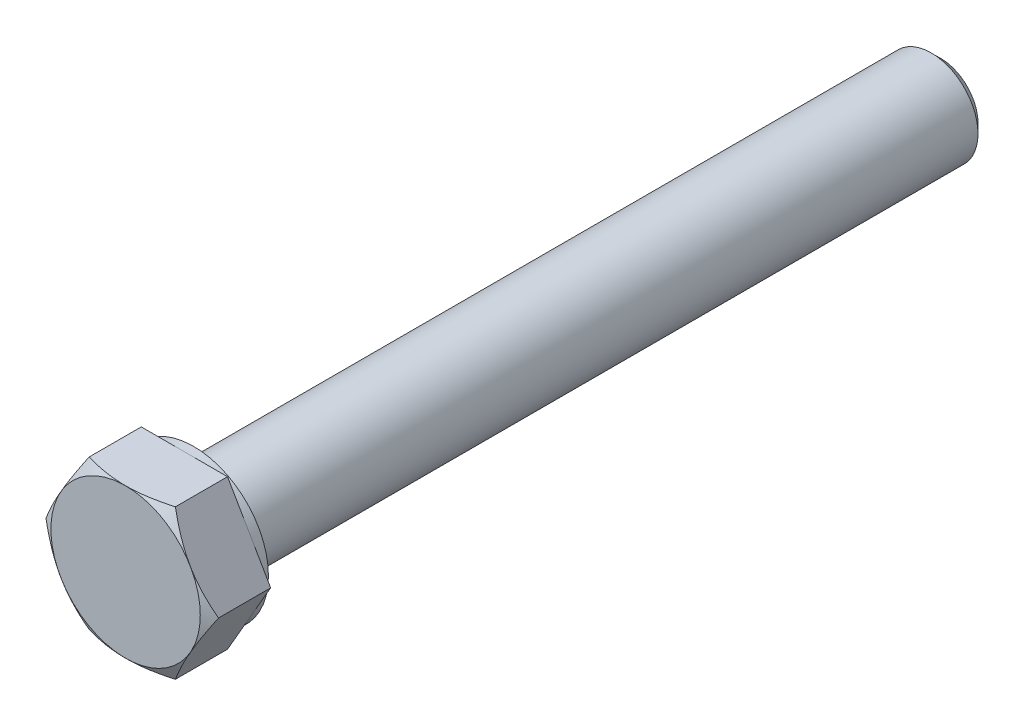
ISO-10303-21;
HEADER;
FILE_DESCRIPTION(('STEP AP214'),'2;1');
FILE_NAME('part.step','',(''),(''),'','','');
FILE_SCHEMA(('AUTOMOTIVE_DESIGN { 1 0 10303 214 1 1 1 1 }'));
ENDSEC;
DATA;
#1=APPLICATION_CONTEXT('core data for automotive mechanical design processes');
#2=APPLICATION_PROTOCOL_DEFINITION('international standard','automotive_design',2000,#1);
#3=PRODUCT_CONTEXT('',#1,'mechanical');
#4=PRODUCT('Part','Part','',(#3));
#5=PRODUCT_RELATED_PRODUCT_CATEGORY('part','',(#4));
#6=PRODUCT_DEFINITION_FORMATION('','',#4);
#7=PRODUCT_DEFINITION_CONTEXT('part definition',#1,'design');
#8=PRODUCT_DEFINITION('design','',#6,#7);
#9=PRODUCT_DEFINITION_SHAPE('','',#8);
#10=(LENGTH_UNIT() NAMED_UNIT(*) SI_UNIT(.MILLI.,.METRE.));
#11=(NAMED_UNIT(*) PLANE_ANGLE_UNIT() SI_UNIT($,.RADIAN.));
#12=(NAMED_UNIT(*) SI_UNIT($,.STERADIAN.) SOLID_ANGLE_UNIT());
#13=UNCERTAINTY_MEASURE_WITH_UNIT(LENGTH_MEASURE(1.E-05),#10,'distance_accuracy_value','');
#14=(GEOMETRIC_REPRESENTATION_CONTEXT(3) GLOBAL_UNCERTAINTY_ASSIGNED_CONTEXT((#13)) GLOBAL_UNIT_ASSIGNED_CONTEXT((#10,
#11,#12)) REPRESENTATION_CONTEXT('',''));
#15=CARTESIAN_POINT('',(0.,0.,0.));
#16=DIRECTION('',(0.,0.,1.));
#17=DIRECTION('',(1.,0.,0.));
#18=AXIS2_PLACEMENT_3D('',#15,#16,#17);
#19=CARTESIAN_POINT('',(0.,0.,3.65));
#20=DIRECTION('',(0.,0.,1.));
#21=DIRECTION('',(1.,0.,0.));
#22=AXIS2_PLACEMENT_3D('',#19,#20,#21);
#23=PLANE('',#22);
#24=CARTESIAN_POINT('',(0.,0.,3.65));
#25=DIRECTION('',(0.,0.,1.));
#26=DIRECTION('',(1.,0.,0.));
#27=AXIS2_PLACEMENT_3D('',#24,#25,#26);
#28=CIRCLE('',#27,4.);
#29=CARTESIAN_POINT('',(4.,0.,3.65));
#30=VERTEX_POINT('',#29);
#31=EDGE_CURVE('E10',#30,#30,#28,.T.);
#32=ORIENTED_EDGE('',*,*,#31,.T.);
#33=EDGE_LOOP('',(#32));
#34=FACE_BOUND('',#33,.T.);
#35=ADVANCED_FACE('F15',(#34),#23,.T.);
#36=CARTESIAN_POINT('',(0.,0.,3.65));
#37=DIRECTION('',(0.,0.,-1.));
#38=DIRECTION('',(1.,0.,0.));
#39=AXIS2_PLACEMENT_3D('',#36,#37,#38);
#40=CONICAL_SURFACE('',#39,4.,1.047197551197);
#41=CARTESIAN_POINT('',(2.31000000000075,4.00103736548175,3.29204283310334));
#42=CARTESIAN_POINT('',(3.46500000000058,2.00051868274099,3.95888239401697));
#43=CARTESIAN_POINT('',(4.6200000000008,-4.3076653355456E-13,3.29204283310245));
#44=(BOUNDED_CURVE() B_SPLINE_CURVE(2,(#41,#42,#43),.UNSPECIFIED.,.F.,
.F.) B_SPLINE_CURVE_WITH_KNOTS((3,3),(0.,1.),
.UNSPECIFIED.) CURVE() GEOMETRIC_REPRESENTATION_ITEM() RATIONAL_B_SPLINE_CURVE((1.,
1.15470053837926,1.)) REPRESENTATION_ITEM(''));
#45=CARTESIAN_POINT('',(2.31,4.001037365484,3.292042833102));
#46=VERTEX_POINT('',#45);
#47=CARTESIAN_POINT('',(4.62,0.,3.292042833102));
#48=VERTEX_POINT('',#47);
#49=EDGE_CURVE('E107',#46,#48,#44,.T.);
#50=ORIENTED_EDGE('',*,*,#49,.F.);
#51=CARTESIAN_POINT('',(-2.30999999999684,4.001037365484,3.29204283310382));
#52=CARTESIAN_POINT('',(1.57740487338743E-12,4.001037365484,3.95888239401673));
#53=CARTESIAN_POINT('',(2.31000000000105,4.001037365484,3.29204283310261));
#54=(BOUNDED_CURVE() B_SPLINE_CURVE(2,(#51,#52,#53),.UNSPECIFIED.,.F.,
.F.) B_SPLINE_CURVE_WITH_KNOTS((3,3),(0.,1.),
.UNSPECIFIED.) CURVE() GEOMETRIC_REPRESENTATION_ITEM() RATIONAL_B_SPLINE_CURVE((1.,
1.15470053837913,1.)) REPRESENTATION_ITEM(''));
#55=CARTESIAN_POINT('',(-2.31,4.001037365484,3.292042833102));
#56=VERTEX_POINT('',#55);
#57=EDGE_CURVE('E176',#56,#46,#54,.T.);
#58=ORIENTED_EDGE('',*,*,#57,.F.);
#59=CARTESIAN_POINT('',(-4.61999999999932,2.13562501016895E-12,3.2920428331033));
#60=CARTESIAN_POINT('',(-3.46499999999944,2.00051868274296,3.95888239401698));
#61=CARTESIAN_POINT('',(-2.30999999999919,4.00103736548443,3.29204283310245));
#62=(BOUNDED_CURVE() B_SPLINE_CURVE(2,(#59,#60,#61),.UNSPECIFIED.,.F.,
.F.) B_SPLINE_CURVE_WITH_KNOTS((3,3),(0.,1.),
.UNSPECIFIED.) CURVE() GEOMETRIC_REPRESENTATION_ITEM() RATIONAL_B_SPLINE_CURVE((1.,
1.15470053837927,1.)) REPRESENTATION_ITEM(''));
#63=CARTESIAN_POINT('',(-4.62,0.,3.292042833102));
#64=VERTEX_POINT('',#63);
#65=EDGE_CURVE('E191',#64,#56,#62,.T.);
#66=ORIENTED_EDGE('',*,*,#65,.F.);
#67=CARTESIAN_POINT('',(-2.31000000000075,-4.00103736548175,3.29204283310334));
#68=CARTESIAN_POINT('',(-3.46500000000057,-2.00051868274101,3.95888239401697));
#69=CARTESIAN_POINT('',(-4.62000000000078,3.91686683087755E-13,3.29204283310246));
#70=(BOUNDED_CURVE() B_SPLINE_CURVE(2,(#67,#68,#69),.UNSPECIFIED.,.F.,
.F.) B_SPLINE_CURVE_WITH_KNOTS((3,3),(0.,1.),
.UNSPECIFIED.) CURVE() GEOMETRIC_REPRESENTATION_ITEM() RATIONAL_B_SPLINE_CURVE((1.,
1.15470053837926,1.)) REPRESENTATION_ITEM(''));
#71=CARTESIAN_POINT('',(-2.31,-4.001037365484,3.292042833102));
#72=VERTEX_POINT('',#71);
#73=EDGE_CURVE('E190',#72,#64,#70,.T.);
#74=ORIENTED_EDGE('',*,*,#73,.F.);
#75=CARTESIAN_POINT('',(2.30999999999684,-4.001037365484,3.29204283310382));
#76=CARTESIAN_POINT('',(-1.57829305180712E-12,-4.001037365484,3.95888239401674));
#77=CARTESIAN_POINT('',(-2.31000000000106,-4.001037365484,3.29204283310261));
#78=(BOUNDED_CURVE() B_SPLINE_CURVE(2,(#75,#76,#77),.UNSPECIFIED.,.F.,
.F.) B_SPLINE_CURVE_WITH_KNOTS((3,3),(0.,1.),
.UNSPECIFIED.) CURVE() GEOMETRIC_REPRESENTATION_ITEM() RATIONAL_B_SPLINE_CURVE((1.,
1.15470053837913,1.)) REPRESENTATION_ITEM(''));
#79=CARTESIAN_POINT('',(2.31,-4.001037365484,3.292042833102));
#80=VERTEX_POINT('',#79);
#81=EDGE_CURVE('E116',#80,#72,#78,.T.);
#82=ORIENTED_EDGE('',*,*,#81,.F.);
#83=CARTESIAN_POINT('',(4.61999999999925,-2.25197638314967E-12,3.29204283310334));
#84=CARTESIAN_POINT('',(3.46499999999942,-2.00051868274301,3.95888239401698));
#85=CARTESIAN_POINT('',(2.30999999999919,-4.00103736548443,3.29204283310245));
#86=(BOUNDED_CURVE() B_SPLINE_CURVE(2,(#83,#84,#85),.UNSPECIFIED.,.F.,
.F.) B_SPLINE_CURVE_WITH_KNOTS((3,3),(0.,1.),
.UNSPECIFIED.) CURVE() GEOMETRIC_REPRESENTATION_ITEM() RATIONAL_B_SPLINE_CURVE((1.,
1.15470053837927,1.)) REPRESENTATION_ITEM(''));
#87=EDGE_CURVE('E110',#48,#80,#86,.T.);
#88=ORIENTED_EDGE('',*,*,#87,.F.);
#89=DIRECTION('',(0.866025403784329,0.,-0.50000000000019));
#90=VECTOR('',#89,1.);
#91=CARTESIAN_POINT('',(4.,0.,3.65));
#92=LINE('',#91,#90);
#93=EDGE_CURVE('E26',#30,#48,#92,.T.);
#94=ORIENTED_EDGE('',*,*,#93,.F.);
#95=ORIENTED_EDGE('',*,*,#31,.F.);
#96=ORIENTED_EDGE('',*,*,#93,.T.);
#97=EDGE_LOOP('',(#50,#58,#66,#74,#82,#88,#94,#95,#96));
#98=FACE_BOUND('',#97,.T.);
#99=ADVANCED_FACE('F104',(#98),#40,.T.);
#100=CARTESIAN_POINT('',(2.31,-4.001037365484,0.));
#101=DIRECTION('',(-0.866025403784329,0.50000000000019,0.));
#102=DIRECTION('',(0.,0.,1.));
#103=AXIS2_PLACEMENT_3D('',#100,#101,#102);
#104=PLANE('',#103);
#105=DIRECTION('',(0.,0.,1.));
#106=VECTOR('',#105,1.);
#107=CARTESIAN_POINT('',(4.62,0.,0.5));
#108=LINE('',#107,#106);
#109=CARTESIAN_POINT('',(4.62,0.,0.5));
#110=VERTEX_POINT('',#109);
#111=EDGE_CURVE('E122',#110,#48,#108,.T.);
#112=ORIENTED_EDGE('',*,*,#111,.T.);
#113=ORIENTED_EDGE('',*,*,#87,.T.);
#114=DIRECTION('',(0.,0.,1.));
#115=VECTOR('',#114,1.);
#116=CARTESIAN_POINT('',(2.31,-4.001037365484,0.));
#117=LINE('',#116,#115);
#118=CARTESIAN_POINT('',(2.31,-4.001037365484,0.5));
#119=VERTEX_POINT('',#118);
#120=EDGE_CURVE('E197',#119,#80,#117,.T.);
#121=ORIENTED_EDGE('',*,*,#120,.F.);
#122=DIRECTION('',(0.50000000000019,0.866025403784329,0.));
#123=VECTOR('',#122,1.);
#124=CARTESIAN_POINT('',(2.8875,-3.000778024113,0.5));
#125=LINE('',#124,#123);
#126=EDGE_CURVE('E125',#119,#110,#125,.T.);
#127=ORIENTED_EDGE('',*,*,#126,.T.);
#128=EDGE_LOOP('',(#112,#113,#121,#127));
#129=FACE_BOUND('',#128,.T.);
#130=ADVANCED_FACE('F123',(#129),#104,.F.);
#131=CARTESIAN_POINT('',(-2.31,-4.001037365484,0.));
#132=DIRECTION('',(0.,1.,0.));
#133=DIRECTION('',(1.,0.,0.));
#134=AXIS2_PLACEMENT_3D('',#131,#132,#133);
#135=PLANE('',#134);
#136=ORIENTED_EDGE('',*,*,#120,.T.);
#137=ORIENTED_EDGE('',*,*,#81,.T.);
#138=DIRECTION('',(0.,0.,1.));
#139=VECTOR('',#138,1.);
#140=CARTESIAN_POINT('',(-2.31,-4.001037365484,0.));
#141=LINE('',#140,#139);
#142=CARTESIAN_POINT('',(-2.31,-4.001037365484,0.5));
#143=VERTEX_POINT('',#142);
#144=EDGE_CURVE('E187',#143,#72,#141,.T.);
#145=ORIENTED_EDGE('',*,*,#144,.F.);
#146=DIRECTION('',(1.,0.,0.));
#147=VECTOR('',#146,1.);
#148=CARTESIAN_POINT('',(-1.155,-4.001037365484,0.5));
#149=LINE('',#148,#147);
#150=EDGE_CURVE('E161',#143,#119,#149,.T.);
#151=ORIENTED_EDGE('',*,*,#150,.T.);
#152=EDGE_LOOP('',(#136,#137,#145,#151));
#153=FACE_BOUND('',#152,.T.);
#154=ADVANCED_FACE('F17',(#153),#135,.F.);
#155=CARTESIAN_POINT('',(-4.62,0.,0.));
#156=DIRECTION('',(0.866025403784329,0.50000000000019,0.));
#157=DIRECTION('',(0.,0.,-1.));
#158=AXIS2_PLACEMENT_3D('',#155,#156,#157);
#159=PLANE('',#158);
#160=ORIENTED_EDGE('',*,*,#144,.T.);
#161=ORIENTED_EDGE('',*,*,#73,.T.);
#162=DIRECTION('',(0.,0.,1.));
#163=VECTOR('',#162,1.);
#164=CARTESIAN_POINT('',(-4.62,0.,0.));
#165=LINE('',#164,#163);
#166=CARTESIAN_POINT('',(-4.62,0.,0.5));
#167=VERTEX_POINT('',#166);
#168=EDGE_CURVE('E181',#167,#64,#165,.T.);
#169=ORIENTED_EDGE('',*,*,#168,.F.);
#170=DIRECTION('',(0.50000000000019,-0.866025403784329,0.));
#171=VECTOR('',#170,1.);
#172=CARTESIAN_POINT('',(-4.0425,-1.000259341371,0.5));
#173=LINE('',#172,#171);
#174=EDGE_CURVE('E165',#167,#143,#173,.T.);
#175=ORIENTED_EDGE('',*,*,#174,.T.);
#176=EDGE_LOOP('',(#160,#161,#169,#175));
#177=FACE_BOUND('',#176,.T.);
#178=ADVANCED_FACE('F273',(#177),#159,.F.);
#179=CARTESIAN_POINT('',(-2.31,4.001037365484,0.));
#180=DIRECTION('',(0.866025403784329,-0.50000000000019,0.));
#181=DIRECTION('',(0.,0.,-1.));
#182=AXIS2_PLACEMENT_3D('',#179,#180,#181);
#183=PLANE('',#182);
#184=ORIENTED_EDGE('',*,*,#168,.T.);
#185=ORIENTED_EDGE('',*,*,#65,.T.);
#186=DIRECTION('',(0.,0.,1.));
#187=VECTOR('',#186,1.);
#188=CARTESIAN_POINT('',(-2.31,4.001037365484,0.));
#189=LINE('',#188,#187);
#190=CARTESIAN_POINT('',(-2.31,4.001037365484,0.5));
#191=VERTEX_POINT('',#190);
#192=EDGE_CURVE('E130',#191,#56,#189,.T.);
#193=ORIENTED_EDGE('',*,*,#192,.F.);
#194=DIRECTION('',(-0.50000000000019,-0.866025403784329,0.));
#195=VECTOR('',#194,1.);
#196=CARTESIAN_POINT('',(-2.8875,3.000778024113,0.5));
#197=LINE('',#196,#195);
#198=EDGE_CURVE('E19',#191,#167,#197,.T.);
#199=ORIENTED_EDGE('',*,*,#198,.T.);
#200=EDGE_LOOP('',(#184,#185,#193,#199));
#201=FACE_BOUND('',#200,.T.);
#202=ADVANCED_FACE('F266',(#201),#183,.F.);
#203=CARTESIAN_POINT('',(2.31,4.001037365484,0.));
#204=DIRECTION('',(0.,-1.,0.));
#205=DIRECTION('',(-1.,0.,0.));
#206=AXIS2_PLACEMENT_3D('',#203,#204,#205);
#207=PLANE('',#206);
#208=ORIENTED_EDGE('',*,*,#192,.T.);
#209=ORIENTED_EDGE('',*,*,#57,.T.);
#210=DIRECTION('',(0.,0.,1.));
#211=VECTOR('',#210,1.);
#212=CARTESIAN_POINT('',(2.31,4.001037365484,0.));
#213=LINE('',#212,#211);
#214=CARTESIAN_POINT('',(2.31,4.001037365484,0.5));
#215=VERTEX_POINT('',#214);
#216=EDGE_CURVE('E133',#215,#46,#213,.T.);
#217=ORIENTED_EDGE('',*,*,#216,.F.);
#218=DIRECTION('',(-1.,0.,0.));
#219=VECTOR('',#218,1.);
#220=CARTESIAN_POINT('',(1.155,4.001037365484,0.5));
#221=LINE('',#220,#219);
#222=EDGE_CURVE('E140',#215,#191,#221,.T.);
#223=ORIENTED_EDGE('',*,*,#222,.T.);
#224=EDGE_LOOP('',(#208,#209,#217,#223));
#225=FACE_BOUND('',#224,.T.);
#226=ADVANCED_FACE('F262',(#225),#207,.F.);
#227=CARTESIAN_POINT('',(4.62,0.,0.));
#228=DIRECTION('',(-0.866025403784329,-0.50000000000019,0.));
#229=DIRECTION('',(-0.50000000000019,0.866025403784329,0.));
#230=AXIS2_PLACEMENT_3D('',#227,#228,#229);
#231=PLANE('',#230);
#232=ORIENTED_EDGE('',*,*,#216,.T.);
#233=ORIENTED_EDGE('',*,*,#49,.T.);
#234=ORIENTED_EDGE('',*,*,#111,.F.);
#235=DIRECTION('',(-0.50000000000019,0.866025403784329,0.));
#236=VECTOR('',#235,1.);
#237=CARTESIAN_POINT('',(4.0425,1.000259341371,0.5));
#238=LINE('',#237,#236);
#239=EDGE_CURVE('E182',#110,#215,#238,.T.);
#240=ORIENTED_EDGE('',*,*,#239,.T.);
#241=EDGE_LOOP('',(#232,#233,#234,#240));
#242=FACE_BOUND('',#241,.T.);
#243=ADVANCED_FACE('F132',(#242),#231,.F.);
#244=CARTESIAN_POINT('',(0.,0.,0.5));
#245=DIRECTION('',(0.,0.,1.));
#246=DIRECTION('',(1.,0.,0.));
#247=AXIS2_PLACEMENT_3D('',#244,#245,#246);
#248=PLANE('',#247);
#249=CARTESIAN_POINT('',(0.,0.,0.5));
#250=DIRECTION('',(0.,0.,1.));
#251=DIRECTION('',(1.,0.,0.));
#252=AXIS2_PLACEMENT_3D('',#249,#250,#251);
#253=CIRCLE('',#252,4.);
#254=CARTESIAN_POINT('',(4.,0.,0.5));
#255=VERTEX_POINT('',#254);
#256=EDGE_CURVE('E175',#255,#255,#253,.T.);
#257=ORIENTED_EDGE('',*,*,#256,.T.);
#258=EDGE_LOOP('',(#257));
#259=FACE_BOUND('',#258,.T.);
#260=ORIENTED_EDGE('',*,*,#239,.F.);
#261=ORIENTED_EDGE('',*,*,#126,.F.);
#262=ORIENTED_EDGE('',*,*,#150,.F.);
#263=ORIENTED_EDGE('',*,*,#174,.F.);
#264=ORIENTED_EDGE('',*,*,#198,.F.);
#265=ORIENTED_EDGE('',*,*,#222,.F.);
#266=EDGE_LOOP('',(#260,#261,#262,#263,#264,#265));
#267=FACE_BOUND('',#266,.T.);
#268=ADVANCED_FACE('F221',(#259,#267),#248,.F.);
#269=CARTESIAN_POINT('',(0.,0.,0.));
#270=DIRECTION('',(0.,0.,1.));
#271=DIRECTION('',(1.,0.,0.));
#272=AXIS2_PLACEMENT_3D('',#269,#270,#271);
#273=CYLINDRICAL_SURFACE('',#272,4.);
#274=CARTESIAN_POINT('',(0.,0.,0.));
#275=DIRECTION('',(0.,0.,1.));
#276=DIRECTION('',(1.,0.,0.));
#277=AXIS2_PLACEMENT_3D('',#274,#275,#276);
#278=CIRCLE('',#277,4.);
#279=CARTESIAN_POINT('',(4.,0.,0.));
#280=VERTEX_POINT('',#279);
#281=EDGE_CURVE('E166',#280,#280,#278,.T.);
#282=ORIENTED_EDGE('',*,*,#281,.T.);
#283=DIRECTION('',(0.,0.,1.));
#284=VECTOR('',#283,1.);
#285=CARTESIAN_POINT('',(4.,0.,0.));
#286=LINE('',#285,#284);
#287=EDGE_CURVE('E170',#280,#255,#286,.T.);
#288=ORIENTED_EDGE('',*,*,#287,.T.);
#289=ORIENTED_EDGE('',*,*,#256,.F.);
#290=ORIENTED_EDGE('',*,*,#287,.F.);
#291=EDGE_LOOP('',(#282,#288,#289,#290));
#292=FACE_BOUND('',#291,.T.);
#293=ADVANCED_FACE('F224',(#292),#273,.T.);
#294=CARTESIAN_POINT('',(0.,0.,0.));
#295=DIRECTION('',(0.,0.,1.));
#296=DIRECTION('',(1.,0.,0.));
#297=AXIS2_PLACEMENT_3D('',#294,#295,#296);
#298=PLANE('',#297);
#299=ORIENTED_EDGE('',*,*,#281,.F.);
#300=EDGE_LOOP('',(#299));
#301=FACE_BOUND('',#300,.T.);
#302=CARTESIAN_POINT('',(0.,0.,0.));
#303=DIRECTION('',(0.,0.,1.));
#304=DIRECTION('',(1.,0.,0.));
#305=AXIS2_PLACEMENT_3D('',#302,#303,#304);
#306=CIRCLE('',#305,2.5);
#307=CARTESIAN_POINT('',(2.5,0.,0.));
#308=VERTEX_POINT('',#307);
#309=EDGE_CURVE('E171',#308,#308,#306,.T.);
#310=ORIENTED_EDGE('',*,*,#309,.T.);
#311=EDGE_LOOP('',(#310));
#312=FACE_BOUND('',#311,.T.);
#313=ADVANCED_FACE('F227',(#301,#312),#298,.F.);
#314=CARTESIAN_POINT('',(0.,0.,-39.5));
#315=DIRECTION('',(0.,0.,1.));
#316=DIRECTION('',(1.,0.,0.));
#317=AXIS2_PLACEMENT_3D('',#314,#315,#316);
#318=CYLINDRICAL_SURFACE('',#317,2.5);
#319=CARTESIAN_POINT('',(0.,0.,-39.5));
#320=DIRECTION('',(0.,0.,1.));
#321=DIRECTION('',(1.,0.,0.));
#322=AXIS2_PLACEMENT_3D('',#319,#320,#321);
#323=CIRCLE('',#322,2.5);
#324=CARTESIAN_POINT('',(2.5,0.,-39.5));
#325=VERTEX_POINT('',#324);
#326=EDGE_CURVE('E156',#325,#325,#323,.T.);
#327=ORIENTED_EDGE('',*,*,#326,.T.);
#328=DIRECTION('',(0.,0.,1.));
#329=VECTOR('',#328,1.);
#330=CARTESIAN_POINT('',(2.5,0.,-39.5));
#331=LINE('',#330,#329);
#332=EDGE_CURVE('E160',#325,#308,#331,.T.);
#333=ORIENTED_EDGE('',*,*,#332,.T.);
#334=ORIENTED_EDGE('',*,*,#309,.F.);
#335=ORIENTED_EDGE('',*,*,#332,.F.);
#336=EDGE_LOOP('',(#327,#333,#334,#335));
#337=FACE_BOUND('',#336,.T.);
#338=ADVANCED_FACE('F230',(#337),#318,.T.);
#339=CARTESIAN_POINT('',(0.,0.,-40.));
#340=DIRECTION('',(0.,0.,1.));
#341=DIRECTION('',(1.,0.,0.));
#342=AXIS2_PLACEMENT_3D('',#339,#340,#341);
#343=CONICAL_SURFACE('',#342,2.,0.785398163404);
#344=CARTESIAN_POINT('',(0.,0.,-40.));
#345=DIRECTION('',(0.,0.,1.));
#346=DIRECTION('',(1.,0.,0.));
#347=AXIS2_PLACEMENT_3D('',#344,#345,#346);
#348=CIRCLE('',#347,2.);
#349=CARTESIAN_POINT('',(2.,0.,-40.));
#350=VERTEX_POINT('',#349);
#351=EDGE_CURVE('E151',#350,#350,#348,.T.);
#352=ORIENTED_EDGE('',*,*,#351,.T.);
#353=DIRECTION('',(0.707106781191048,0.,0.707106781182048));
#354=VECTOR('',#353,1.);
#355=CARTESIAN_POINT('',(2.,0.,-40.));
#356=LINE('',#355,#354);
#357=EDGE_CURVE('E155',#350,#325,#356,.T.);
#358=ORIENTED_EDGE('',*,*,#357,.T.);
#359=ORIENTED_EDGE('',*,*,#326,.F.);
#360=ORIENTED_EDGE('',*,*,#357,.F.);
#361=EDGE_LOOP('',(#352,#358,#359,#360));
#362=FACE_BOUND('',#361,.T.);
#363=ADVANCED_FACE('F301',(#362),#343,.T.);
#364=CARTESIAN_POINT('',(0.,0.,-40.));
#365=DIRECTION('',(0.,0.,1.));
#366=DIRECTION('',(1.,0.,0.));
#367=AXIS2_PLACEMENT_3D('',#364,#365,#366);
#368=PLANE('',#367);
#369=ORIENTED_EDGE('',*,*,#351,.F.);
#370=EDGE_LOOP('',(#369));
#371=FACE_BOUND('',#370,.T.);
#372=ADVANCED_FACE('F295',(#371),#368,.F.);
#373=CLOSED_SHELL('',(#35,#99,#130,#154,#178,#202,#226,#243,#268,#293,#313,#338,#363,#372));
#374=MANIFOLD_SOLID_BREP('B1',#373);
#375=ADVANCED_BREP_SHAPE_REPRESENTATION('',(#18,#374),#14);
#376=SHAPE_DEFINITION_REPRESENTATION(#9,#375);
ENDSEC;
END-ISO-10303-21;
